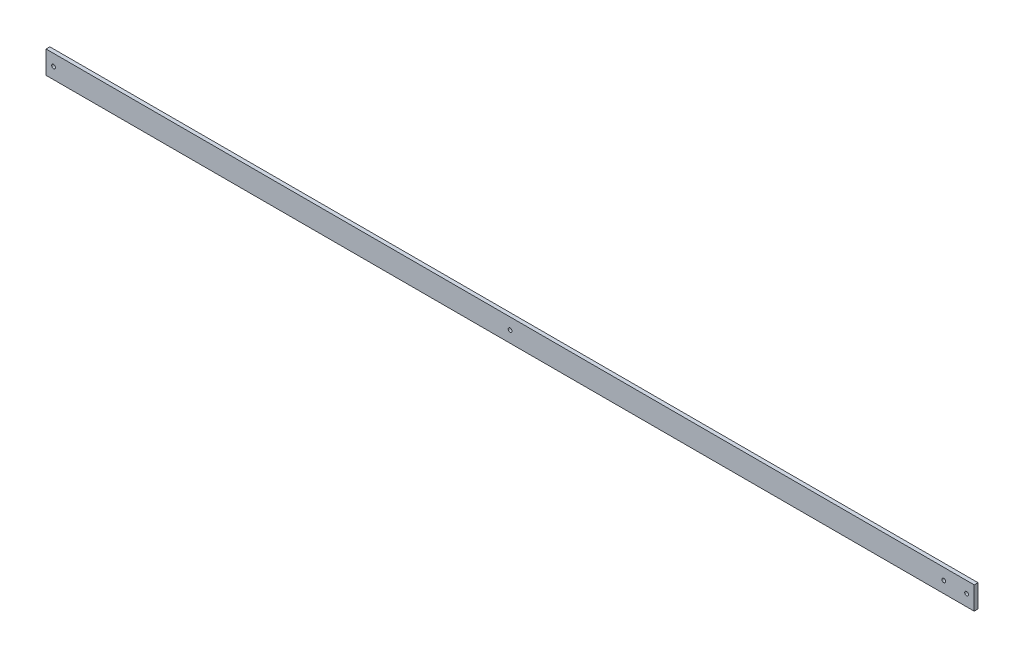
ISO-10303-21;
HEADER;
FILE_DESCRIPTION(('STEP AP214'),'2;1');
FILE_NAME('part.step','',(''),(''),'','','');
FILE_SCHEMA(('AUTOMOTIVE_DESIGN { 1 0 10303 214 1 1 1 1 }'));
ENDSEC;
DATA;
#1=APPLICATION_CONTEXT('core data for automotive mechanical design processes');
#2=APPLICATION_PROTOCOL_DEFINITION('international standard','automotive_design',2000,#1);
#3=PRODUCT_CONTEXT('',#1,'mechanical');
#4=PRODUCT('Part','Part','',(#3));
#5=PRODUCT_RELATED_PRODUCT_CATEGORY('part','',(#4));
#6=PRODUCT_DEFINITION_FORMATION('','',#4);
#7=PRODUCT_DEFINITION_CONTEXT('part definition',#1,'design');
#8=PRODUCT_DEFINITION('design','',#6,#7);
#9=PRODUCT_DEFINITION_SHAPE('','',#8);
#10=(LENGTH_UNIT() NAMED_UNIT(*) SI_UNIT(.MILLI.,.METRE.));
#11=(NAMED_UNIT(*) PLANE_ANGLE_UNIT() SI_UNIT($,.RADIAN.));
#12=(NAMED_UNIT(*) SI_UNIT($,.STERADIAN.) SOLID_ANGLE_UNIT());
#13=UNCERTAINTY_MEASURE_WITH_UNIT(LENGTH_MEASURE(1.E-05),#10,'distance_accuracy_value','');
#14=(GEOMETRIC_REPRESENTATION_CONTEXT(3) GLOBAL_UNCERTAINTY_ASSIGNED_CONTEXT((#13)) GLOBAL_UNIT_ASSIGNED_CONTEXT((#10,
#11,#12)) REPRESENTATION_CONTEXT('',''));
#15=CARTESIAN_POINT('',(0.,0.,0.));
#16=DIRECTION('',(0.,0.,1.));
#17=DIRECTION('',(1.,0.,0.));
#18=AXIS2_PLACEMENT_3D('',#15,#16,#17);
#19=CARTESIAN_POINT('',(0.,0.,3.175));
#20=DIRECTION('',(0.,0.,-1.));
#21=DIRECTION('',(-1.,0.,0.));
#22=AXIS2_PLACEMENT_3D('',#19,#20,#21);
#23=PLANE('',#22);
#24=DIRECTION('',(0.,-1.,0.));
#25=VECTOR('',#24,1.);
#26=CARTESIAN_POINT('',(0.,0.,3.175));
#27=LINE('',#26,#25);
#28=CARTESIAN_POINT('',(0.,19.05,3.175));
#29=VERTEX_POINT('',#28);
#30=CARTESIAN_POINT('',(0.,0.,3.175));
#31=VERTEX_POINT('',#30);
#32=EDGE_CURVE('E89',#29,#31,#27,.T.);
#33=ORIENTED_EDGE('',*,*,#32,.T.);
#34=DIRECTION('',(1.,0.,0.));
#35=VECTOR('',#34,1.);
#36=CARTESIAN_POINT('',(0.,0.,3.175));
#37=LINE('',#36,#35);
#38=CARTESIAN_POINT('',(774.7,0.,3.175));
#39=VERTEX_POINT('',#38);
#40=EDGE_CURVE('E84',#31,#39,#37,.T.);
#41=ORIENTED_EDGE('',*,*,#40,.T.);
#42=DIRECTION('',(0.,1.,0.));
#43=VECTOR('',#42,1.);
#44=CARTESIAN_POINT('',(774.7,0.,3.175));
#45=LINE('',#44,#43);
#46=CARTESIAN_POINT('',(774.7,19.05,3.175));
#47=VERTEX_POINT('',#46);
#48=EDGE_CURVE('E87',#39,#47,#45,.T.);
#49=ORIENTED_EDGE('',*,*,#48,.T.);
#50=DIRECTION('',(-1.,0.,0.));
#51=VECTOR('',#50,1.);
#52=CARTESIAN_POINT('',(0.,19.05,3.175));
#53=LINE('',#52,#51);
#54=EDGE_CURVE('E54',#47,#29,#53,.T.);
#55=ORIENTED_EDGE('',*,*,#54,.T.);
#56=EDGE_LOOP('',(#33,#41,#49,#55));
#57=FACE_BOUND('',#56,.T.);
#58=CARTESIAN_POINT('',(6.35,9.525,3.175));
#59=DIRECTION('',(0.,0.,1.));
#60=DIRECTION('',(1.,0.,0.));
#61=AXIS2_PLACEMENT_3D('',#58,#59,#60);
#62=CIRCLE('',#61,1.5875);
#63=CARTESIAN_POINT('',(7.9375,9.525,3.175));
#64=VERTEX_POINT('',#63);
#65=EDGE_CURVE('E104',#64,#64,#62,.T.);
#66=ORIENTED_EDGE('',*,*,#65,.F.);
#67=EDGE_LOOP('',(#66));
#68=FACE_BOUND('',#67,.T.);
#69=CARTESIAN_POINT('',(387.35,9.525,3.175));
#70=DIRECTION('',(0.,0.,1.));
#71=DIRECTION('',(1.,0.,0.));
#72=AXIS2_PLACEMENT_3D('',#69,#70,#71);
#73=CIRCLE('',#72,1.58750000000004);
#74=CARTESIAN_POINT('',(388.9375,9.525,3.175));
#75=VERTEX_POINT('',#74);
#76=EDGE_CURVE('E119',#75,#75,#73,.T.);
#77=ORIENTED_EDGE('',*,*,#76,.F.);
#78=EDGE_LOOP('',(#77));
#79=FACE_BOUND('',#78,.T.);
#80=CARTESIAN_POINT('',(768.35,9.525,3.175));
#81=DIRECTION('',(0.,0.,1.));
#82=DIRECTION('',(1.,0.,0.));
#83=AXIS2_PLACEMENT_3D('',#80,#81,#82);
#84=CIRCLE('',#83,1.58749999999993);
#85=CARTESIAN_POINT('',(769.9375,9.525,3.175));
#86=VERTEX_POINT('',#85);
#87=EDGE_CURVE('E125',#86,#86,#84,.T.);
#88=ORIENTED_EDGE('',*,*,#87,.F.);
#89=EDGE_LOOP('',(#88));
#90=FACE_BOUND('',#89,.T.);
#91=CARTESIAN_POINT('',(749.3,9.525,3.175));
#92=DIRECTION('',(0.,0.,1.));
#93=DIRECTION('',(1.,0.,0.));
#94=AXIS2_PLACEMENT_3D('',#91,#92,#93);
#95=CIRCLE('',#94,1.58749999999993);
#96=CARTESIAN_POINT('',(750.8875,9.525,3.175));
#97=VERTEX_POINT('',#96);
#98=EDGE_CURVE('E131',#97,#97,#95,.T.);
#99=ORIENTED_EDGE('',*,*,#98,.F.);
#100=EDGE_LOOP('',(#99));
#101=FACE_BOUND('',#100,.T.);
#102=ADVANCED_FACE('F37',(#57,#68,#79,#90,#101),#23,.F.);
#103=CARTESIAN_POINT('',(0.,0.,0.));
#104=DIRECTION('',(0.,0.,-1.));
#105=DIRECTION('',(-1.,0.,0.));
#106=AXIS2_PLACEMENT_3D('',#103,#104,#105);
#107=PLANE('',#106);
#108=CARTESIAN_POINT('',(768.35,9.525,0.));
#109=DIRECTION('',(0.,0.,1.));
#110=DIRECTION('',(1.,0.,0.));
#111=AXIS2_PLACEMENT_3D('',#108,#109,#110);
#112=CIRCLE('',#111,1.58749999999993);
#113=CARTESIAN_POINT('',(769.9375,9.525,0.));
#114=VERTEX_POINT('',#113);
#115=EDGE_CURVE('E128',#114,#114,#112,.T.);
#116=ORIENTED_EDGE('',*,*,#115,.T.);
#117=EDGE_LOOP('',(#116));
#118=FACE_BOUND('',#117,.T.);
#119=CARTESIAN_POINT('',(6.35,9.525,0.));
#120=DIRECTION('',(0.,0.,1.));
#121=DIRECTION('',(1.,0.,0.));
#122=AXIS2_PLACEMENT_3D('',#119,#120,#121);
#123=CIRCLE('',#122,1.5875);
#124=CARTESIAN_POINT('',(7.9375,9.525,0.));
#125=VERTEX_POINT('',#124);
#126=EDGE_CURVE('E116',#125,#125,#123,.T.);
#127=ORIENTED_EDGE('',*,*,#126,.T.);
#128=EDGE_LOOP('',(#127));
#129=FACE_BOUND('',#128,.T.);
#130=DIRECTION('',(0.,-1.,0.));
#131=VECTOR('',#130,1.);
#132=CARTESIAN_POINT('',(0.,0.,0.));
#133=LINE('',#132,#131);
#134=CARTESIAN_POINT('',(0.,19.05,0.));
#135=VERTEX_POINT('',#134);
#136=CARTESIAN_POINT('',(0.,0.,0.));
#137=VERTEX_POINT('',#136);
#138=EDGE_CURVE('E101',#135,#137,#133,.T.);
#139=ORIENTED_EDGE('',*,*,#138,.F.);
#140=DIRECTION('',(-1.,0.,0.));
#141=VECTOR('',#140,1.);
#142=CARTESIAN_POINT('',(0.,19.05,0.));
#143=LINE('',#142,#141);
#144=CARTESIAN_POINT('',(774.7,19.05,0.));
#145=VERTEX_POINT('',#144);
#146=EDGE_CURVE('E77',#145,#135,#143,.T.);
#147=ORIENTED_EDGE('',*,*,#146,.F.);
#148=DIRECTION('',(0.,1.,0.));
#149=VECTOR('',#148,1.);
#150=CARTESIAN_POINT('',(774.7,0.,0.));
#151=LINE('',#150,#149);
#152=CARTESIAN_POINT('',(774.7,0.,0.));
#153=VERTEX_POINT('',#152);
#154=EDGE_CURVE('E71',#153,#145,#151,.T.);
#155=ORIENTED_EDGE('',*,*,#154,.F.);
#156=DIRECTION('',(1.,0.,0.));
#157=VECTOR('',#156,1.);
#158=CARTESIAN_POINT('',(0.,0.,0.));
#159=LINE('',#158,#157);
#160=EDGE_CURVE('E93',#137,#153,#159,.T.);
#161=ORIENTED_EDGE('',*,*,#160,.F.);
#162=EDGE_LOOP('',(#139,#147,#155,#161));
#163=FACE_BOUND('',#162,.T.);
#164=CARTESIAN_POINT('',(387.35,9.525,0.));
#165=DIRECTION('',(0.,0.,1.));
#166=DIRECTION('',(1.,0.,0.));
#167=AXIS2_PLACEMENT_3D('',#164,#165,#166);
#168=CIRCLE('',#167,1.58750000000004);
#169=CARTESIAN_POINT('',(388.9375,9.525,0.));
#170=VERTEX_POINT('',#169);
#171=EDGE_CURVE('E122',#170,#170,#168,.T.);
#172=ORIENTED_EDGE('',*,*,#171,.T.);
#173=EDGE_LOOP('',(#172));
#174=FACE_BOUND('',#173,.T.);
#175=CARTESIAN_POINT('',(749.3,9.525,0.));
#176=DIRECTION('',(0.,0.,1.));
#177=DIRECTION('',(1.,0.,0.));
#178=AXIS2_PLACEMENT_3D('',#175,#176,#177);
#179=CIRCLE('',#178,1.58749999999993);
#180=CARTESIAN_POINT('',(750.8875,9.525,0.));
#181=VERTEX_POINT('',#180);
#182=EDGE_CURVE('E134',#181,#181,#179,.T.);
#183=ORIENTED_EDGE('',*,*,#182,.T.);
#184=EDGE_LOOP('',(#183));
#185=FACE_BOUND('',#184,.T.);
#186=ADVANCED_FACE('F112',(#118,#129,#163,#174,#185),#107,.T.);
#187=CARTESIAN_POINT('',(0.,0.,3.175));
#188=DIRECTION('',(1.,0.,0.));
#189=DIRECTION('',(0.,0.,-1.));
#190=AXIS2_PLACEMENT_3D('',#187,#188,#189);
#191=PLANE('',#190);
#192=ORIENTED_EDGE('',*,*,#138,.T.);
#193=DIRECTION('',(0.,0.,-1.));
#194=VECTOR('',#193,1.);
#195=CARTESIAN_POINT('',(0.,0.,3.175));
#196=LINE('',#195,#194);
#197=EDGE_CURVE('E11',#31,#137,#196,.T.);
#198=ORIENTED_EDGE('',*,*,#197,.F.);
#199=ORIENTED_EDGE('',*,*,#32,.F.);
#200=DIRECTION('',(0.,0.,-1.));
#201=VECTOR('',#200,1.);
#202=CARTESIAN_POINT('',(0.,19.05,3.175));
#203=LINE('',#202,#201);
#204=EDGE_CURVE('E97',#29,#135,#203,.T.);
#205=ORIENTED_EDGE('',*,*,#204,.T.);
#206=EDGE_LOOP('',(#192,#198,#199,#205));
#207=FACE_BOUND('',#206,.T.);
#208=ADVANCED_FACE('F39',(#207),#191,.F.);
#209=CARTESIAN_POINT('',(0.,0.,3.175));
#210=DIRECTION('',(0.,1.,0.));
#211=DIRECTION('',(0.,0.,1.));
#212=AXIS2_PLACEMENT_3D('',#209,#210,#211);
#213=PLANE('',#212);
#214=ORIENTED_EDGE('',*,*,#160,.T.);
#215=DIRECTION('',(0.,0.,-1.));
#216=VECTOR('',#215,1.);
#217=CARTESIAN_POINT('',(774.7,0.,3.175));
#218=LINE('',#217,#216);
#219=EDGE_CURVE('E46',#39,#153,#218,.T.);
#220=ORIENTED_EDGE('',*,*,#219,.F.);
#221=ORIENTED_EDGE('',*,*,#40,.F.);
#222=ORIENTED_EDGE('',*,*,#197,.T.);
#223=EDGE_LOOP('',(#214,#220,#221,#222));
#224=FACE_BOUND('',#223,.T.);
#225=ADVANCED_FACE('F92',(#224),#213,.F.);
#226=CARTESIAN_POINT('',(774.7,0.,3.175));
#227=DIRECTION('',(-1.,0.,0.));
#228=DIRECTION('',(0.,0.,1.));
#229=AXIS2_PLACEMENT_3D('',#226,#227,#228);
#230=PLANE('',#229);
#231=ORIENTED_EDGE('',*,*,#154,.T.);
#232=DIRECTION('',(0.,0.,-1.));
#233=VECTOR('',#232,1.);
#234=CARTESIAN_POINT('',(774.7,19.05,3.175));
#235=LINE('',#234,#233);
#236=EDGE_CURVE('E94',#47,#145,#235,.T.);
#237=ORIENTED_EDGE('',*,*,#236,.F.);
#238=ORIENTED_EDGE('',*,*,#48,.F.);
#239=ORIENTED_EDGE('',*,*,#219,.T.);
#240=EDGE_LOOP('',(#231,#237,#238,#239));
#241=FACE_BOUND('',#240,.T.);
#242=ADVANCED_FACE('F95',(#241),#230,.F.);
#243=CARTESIAN_POINT('',(0.,19.05,3.175));
#244=DIRECTION('',(0.,-1.,0.));
#245=DIRECTION('',(0.,0.,-1.));
#246=AXIS2_PLACEMENT_3D('',#243,#244,#245);
#247=PLANE('',#246);
#248=ORIENTED_EDGE('',*,*,#146,.T.);
#249=ORIENTED_EDGE('',*,*,#204,.F.);
#250=ORIENTED_EDGE('',*,*,#54,.F.);
#251=ORIENTED_EDGE('',*,*,#236,.T.);
#252=EDGE_LOOP('',(#248,#249,#250,#251));
#253=FACE_BOUND('',#252,.T.);
#254=ADVANCED_FACE('F109',(#253),#247,.F.);
#255=CARTESIAN_POINT('',(6.35,9.525,3.175));
#256=DIRECTION('',(0.,0.,-1.));
#257=DIRECTION('',(-1.,0.,0.));
#258=AXIS2_PLACEMENT_3D('',#255,#256,#257);
#259=CYLINDRICAL_SURFACE('',#258,1.5875);
#260=ORIENTED_EDGE('',*,*,#65,.T.);
#261=EDGE_LOOP('',(#260));
#262=FACE_BOUND('',#261,.T.);
#263=ORIENTED_EDGE('',*,*,#126,.F.);
#264=EDGE_LOOP('',(#263));
#265=FACE_BOUND('',#264,.T.);
#266=ADVANCED_FACE('F151',(#262,#265),#259,.F.);
#267=CARTESIAN_POINT('',(387.35,9.525,3.175));
#268=DIRECTION('',(0.,0.,-1.));
#269=DIRECTION('',(-1.,0.,0.));
#270=AXIS2_PLACEMENT_3D('',#267,#268,#269);
#271=CYLINDRICAL_SURFACE('',#270,1.58750000000004);
#272=ORIENTED_EDGE('',*,*,#76,.T.);
#273=EDGE_LOOP('',(#272));
#274=FACE_BOUND('',#273,.T.);
#275=ORIENTED_EDGE('',*,*,#171,.F.);
#276=EDGE_LOOP('',(#275));
#277=FACE_BOUND('',#276,.T.);
#278=ADVANCED_FACE('F197',(#274,#277),#271,.F.);
#279=CARTESIAN_POINT('',(768.35,9.525,3.175));
#280=DIRECTION('',(0.,0.,-1.));
#281=DIRECTION('',(-1.,0.,0.));
#282=AXIS2_PLACEMENT_3D('',#279,#280,#281);
#283=CYLINDRICAL_SURFACE('',#282,1.58749999999993);
#284=ORIENTED_EDGE('',*,*,#87,.T.);
#285=EDGE_LOOP('',(#284));
#286=FACE_BOUND('',#285,.T.);
#287=ORIENTED_EDGE('',*,*,#115,.F.);
#288=EDGE_LOOP('',(#287));
#289=FACE_BOUND('',#288,.T.);
#290=ADVANCED_FACE('F205',(#286,#289),#283,.F.);
#291=CARTESIAN_POINT('',(749.3,9.525,3.175));
#292=DIRECTION('',(0.,0.,-1.));
#293=DIRECTION('',(-1.,0.,0.));
#294=AXIS2_PLACEMENT_3D('',#291,#292,#293);
#295=CYLINDRICAL_SURFACE('',#294,1.58749999999993);
#296=ORIENTED_EDGE('',*,*,#98,.T.);
#297=EDGE_LOOP('',(#296));
#298=FACE_BOUND('',#297,.T.);
#299=ORIENTED_EDGE('',*,*,#182,.F.);
#300=EDGE_LOOP('',(#299));
#301=FACE_BOUND('',#300,.T.);
#302=ADVANCED_FACE('F140',(#298,#301),#295,.F.);
#303=CLOSED_SHELL('',(#102,#186,#208,#225,#242,#254,#266,#278,#290,#302));
#304=MANIFOLD_SOLID_BREP('B2',#303);
#305=ADVANCED_BREP_SHAPE_REPRESENTATION('',(#18,#304),#14);
#306=SHAPE_DEFINITION_REPRESENTATION(#9,#305);
ENDSEC;
END-ISO-10303-21;
